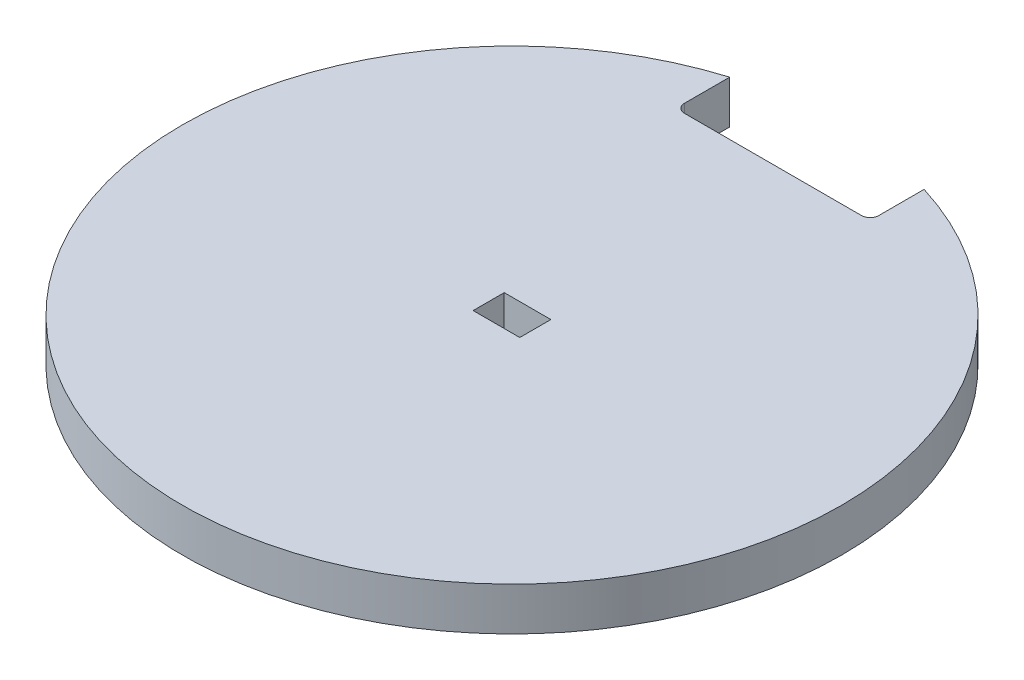
ISO-10303-21;
HEADER;
FILE_DESCRIPTION(('STEP AP214'),'2;1');
FILE_NAME('part.step','',(''),(''),'','','');
FILE_SCHEMA(('AUTOMOTIVE_DESIGN { 1 0 10303 214 1 1 1 1 }'));
ENDSEC;
DATA;
#1=APPLICATION_CONTEXT('core data for automotive mechanical design processes');
#2=APPLICATION_PROTOCOL_DEFINITION('international standard','automotive_design',2000,#1);
#3=PRODUCT_CONTEXT('',#1,'mechanical');
#4=PRODUCT('Part','Part','',(#3));
#5=PRODUCT_RELATED_PRODUCT_CATEGORY('part','',(#4));
#6=PRODUCT_DEFINITION_FORMATION('','',#4);
#7=PRODUCT_DEFINITION_CONTEXT('part definition',#1,'design');
#8=PRODUCT_DEFINITION('design','',#6,#7);
#9=PRODUCT_DEFINITION_SHAPE('','',#8);
#10=(LENGTH_UNIT() NAMED_UNIT(*) SI_UNIT(.MILLI.,.METRE.));
#11=(NAMED_UNIT(*) PLANE_ANGLE_UNIT() SI_UNIT($,.RADIAN.));
#12=(NAMED_UNIT(*) SI_UNIT($,.STERADIAN.) SOLID_ANGLE_UNIT());
#13=UNCERTAINTY_MEASURE_WITH_UNIT(LENGTH_MEASURE(1.E-05),#10,'distance_accuracy_value','');
#14=(GEOMETRIC_REPRESENTATION_CONTEXT(3) GLOBAL_UNCERTAINTY_ASSIGNED_CONTEXT((#13)) GLOBAL_UNIT_ASSIGNED_CONTEXT((#10,
#11,#12)) REPRESENTATION_CONTEXT('',''));
#15=CARTESIAN_POINT('',(0.,0.,0.));
#16=DIRECTION('',(0.,0.,1.));
#17=DIRECTION('',(1.,0.,0.));
#18=AXIS2_PLACEMENT_3D('',#15,#16,#17);
#19=CARTESIAN_POINT('',(-15.3543977496095,5.,0.));
#20=DIRECTION('',(1.,0.,0.));
#21=DIRECTION('',(0.,0.,-1.));
#22=AXIS2_PLACEMENT_3D('',#19,#20,#21);
#23=PLANE('',#22);
#24=DIRECTION('',(0.,0.,1.));
#25=VECTOR('',#24,1.);
#26=CARTESIAN_POINT('',(-15.3543977496095,0.,0.));
#27=LINE('',#26,#25);
#28=CARTESIAN_POINT('',(-15.3543977496095,0.,-36.4502996122106));
#29=VERTEX_POINT('',#28);
#30=CARTESIAN_POINT('',(-15.3543977496095,0.,-31.2026382228691));
#31=VERTEX_POINT('',#30);
#32=EDGE_CURVE('E179',#29,#31,#27,.T.);
#33=ORIENTED_EDGE('',*,*,#32,.F.);
#34=DIRECTION('',(0.,-1.,0.));
#35=VECTOR('',#34,1.);
#36=CARTESIAN_POINT('',(-15.3543977496095,5.,-36.4502996122106));
#37=LINE('',#36,#35);
#38=CARTESIAN_POINT('',(-15.3543977496095,5.,-36.4502996122106));
#39=VERTEX_POINT('',#38);
#40=EDGE_CURVE('E11',#39,#29,#37,.T.);
#41=ORIENTED_EDGE('',*,*,#40,.F.);
#42=DIRECTION('',(0.,0.,1.));
#43=VECTOR('',#42,1.);
#44=CARTESIAN_POINT('',(-15.3543977496095,5.,0.));
#45=LINE('',#44,#43);
#46=CARTESIAN_POINT('',(-15.3543977496095,5.,-31.2026382228691));
#47=VERTEX_POINT('',#46);
#48=EDGE_CURVE('E239',#39,#47,#45,.T.);
#49=ORIENTED_EDGE('',*,*,#48,.T.);
#50=DIRECTION('',(0.,-1.,0.));
#51=VECTOR('',#50,1.);
#52=CARTESIAN_POINT('',(-15.3543977496095,5.,-31.2026382228691));
#53=LINE('',#52,#51);
#54=EDGE_CURVE('E67',#47,#31,#53,.T.);
#55=ORIENTED_EDGE('',*,*,#54,.T.);
#56=EDGE_LOOP('',(#33,#41,#49,#55));
#57=FACE_BOUND('',#56,.T.);
#58=ADVANCED_FACE('F47',(#57),#23,.T.);
#59=CARTESIAN_POINT('',(-4.10439774960947,5.,0.));
#60=DIRECTION('',(0.,-1.,0.));
#61=DIRECTION('',(0.,0.,-1.));
#62=AXIS2_PLACEMENT_3D('',#59,#60,#61);
#63=CYLINDRICAL_SURFACE('',#62,38.1469113011777);
#64=CARTESIAN_POINT('',(-4.10439774960947,0.,0.));
#65=DIRECTION('',(0.,1.,0.));
#66=DIRECTION('',(0.,0.,1.));
#67=AXIS2_PLACEMENT_3D('',#64,#65,#66);
#68=CIRCLE('',#67,38.1469113011777);
#69=CARTESIAN_POINT('',(7.14560225039053,0.,-36.4502996122106));
#70=VERTEX_POINT('',#69);
#71=EDGE_CURVE('E182',#29,#70,#68,.T.);
#72=ORIENTED_EDGE('',*,*,#71,.T.);
#73=DIRECTION('',(0.,-1.,0.));
#74=VECTOR('',#73,1.);
#75=CARTESIAN_POINT('',(7.14560225039053,5.,-36.4502996122106));
#76=LINE('',#75,#74);
#77=CARTESIAN_POINT('',(7.14560225039053,5.,-36.4502996122106));
#78=VERTEX_POINT('',#77);
#79=EDGE_CURVE('E58',#78,#70,#76,.T.);
#80=ORIENTED_EDGE('',*,*,#79,.F.);
#81=CARTESIAN_POINT('',(-4.10439774960947,5.,0.));
#82=DIRECTION('',(0.,1.,0.));
#83=DIRECTION('',(0.,0.,1.));
#84=AXIS2_PLACEMENT_3D('',#81,#82,#83);
#85=CIRCLE('',#84,38.1469113011777);
#86=EDGE_CURVE('E244',#39,#78,#85,.T.);
#87=ORIENTED_EDGE('',*,*,#86,.F.);
#88=ORIENTED_EDGE('',*,*,#40,.T.);
#89=EDGE_LOOP('',(#72,#80,#87,#88));
#90=FACE_BOUND('',#89,.T.);
#91=ADVANCED_FACE('F254',(#90),#63,.T.);
#92=CARTESIAN_POINT('',(7.14560225039048,5.,0.));
#93=DIRECTION('',(1.,0.,0.));
#94=DIRECTION('',(0.,0.,-1.));
#95=AXIS2_PLACEMENT_3D('',#92,#93,#94);
#96=PLANE('',#95);
#97=DIRECTION('',(0.,0.,1.));
#98=VECTOR('',#97,1.);
#99=CARTESIAN_POINT('',(7.14560225039048,0.,0.));
#100=LINE('',#99,#98);
#101=CARTESIAN_POINT('',(7.14560225039052,0.,-31.2026382228691));
#102=VERTEX_POINT('',#101);
#103=EDGE_CURVE('E186',#70,#102,#100,.T.);
#104=ORIENTED_EDGE('',*,*,#103,.T.);
#105=DIRECTION('',(0.,-1.,0.));
#106=VECTOR('',#105,1.);
#107=CARTESIAN_POINT('',(7.14560225039052,5.,-31.2026382228691));
#108=LINE('',#107,#106);
#109=CARTESIAN_POINT('',(7.14560225039052,5.,-31.2026382228691));
#110=VERTEX_POINT('',#109);
#111=EDGE_CURVE('E142',#110,#102,#108,.T.);
#112=ORIENTED_EDGE('',*,*,#111,.F.);
#113=DIRECTION('',(0.,0.,1.));
#114=VECTOR('',#113,1.);
#115=CARTESIAN_POINT('',(7.14560225039048,5.,0.));
#116=LINE('',#115,#114);
#117=EDGE_CURVE('E151',#78,#110,#116,.T.);
#118=ORIENTED_EDGE('',*,*,#117,.F.);
#119=ORIENTED_EDGE('',*,*,#79,.T.);
#120=EDGE_LOOP('',(#104,#112,#118,#119));
#121=FACE_BOUND('',#120,.T.);
#122=ADVANCED_FACE('F257',(#121),#96,.F.);
#123=CARTESIAN_POINT('',(6.14560225039052,5.,-31.2026382228691));
#124=DIRECTION('',(0.,-1.,0.));
#125=DIRECTION('',(0.,0.,-1.));
#126=AXIS2_PLACEMENT_3D('',#123,#124,#125);
#127=CYLINDRICAL_SURFACE('',#126,1.);
#128=CARTESIAN_POINT('',(6.14560225039052,0.,-31.2026382228691));
#129=DIRECTION('',(0.,1.,0.));
#130=DIRECTION('',(0.,0.,1.));
#131=AXIS2_PLACEMENT_3D('',#128,#129,#130);
#132=CIRCLE('',#131,1.);
#133=CARTESIAN_POINT('',(6.14560225039052,0.,-30.2026382228691));
#134=VERTEX_POINT('',#133);
#135=EDGE_CURVE('E137',#134,#102,#132,.T.);
#136=ORIENTED_EDGE('',*,*,#135,.F.);
#137=DIRECTION('',(0.,-1.,0.));
#138=VECTOR('',#137,1.);
#139=CARTESIAN_POINT('',(6.14560225039052,5.,-30.2026382228691));
#140=LINE('',#139,#138);
#141=CARTESIAN_POINT('',(6.14560225039052,5.,-30.2026382228691));
#142=VERTEX_POINT('',#141);
#143=EDGE_CURVE('E132',#142,#134,#140,.T.);
#144=ORIENTED_EDGE('',*,*,#143,.F.);
#145=CARTESIAN_POINT('',(6.14560225039052,5.,-31.2026382228691));
#146=DIRECTION('',(0.,1.,0.));
#147=DIRECTION('',(0.,0.,1.));
#148=AXIS2_PLACEMENT_3D('',#145,#146,#147);
#149=CIRCLE('',#148,1.);
#150=EDGE_CURVE('E135',#142,#110,#149,.T.);
#151=ORIENTED_EDGE('',*,*,#150,.T.);
#152=ORIENTED_EDGE('',*,*,#111,.T.);
#153=EDGE_LOOP('',(#136,#144,#151,#152));
#154=FACE_BOUND('',#153,.T.);
#155=ADVANCED_FACE('F134',(#154),#127,.F.);
#156=CARTESIAN_POINT('',(0.,5.,-30.2026382228691));
#157=DIRECTION('',(0.,0.,-1.));
#158=DIRECTION('',(-1.,0.,0.));
#159=AXIS2_PLACEMENT_3D('',#156,#157,#158);
#160=PLANE('',#159);
#161=DIRECTION('',(1.,0.,0.));
#162=VECTOR('',#161,1.);
#163=CARTESIAN_POINT('',(0.,0.,-30.2026382228691));
#164=LINE('',#163,#162);
#165=CARTESIAN_POINT('',(-14.3543977496095,0.,-30.2026382228691));
#166=VERTEX_POINT('',#165);
#167=EDGE_CURVE('E192',#166,#134,#164,.T.);
#168=ORIENTED_EDGE('',*,*,#167,.F.);
#169=DIRECTION('',(0.,-1.,0.));
#170=VECTOR('',#169,1.);
#171=CARTESIAN_POINT('',(-14.3543977496095,5.,-30.2026382228691));
#172=LINE('',#171,#170);
#173=CARTESIAN_POINT('',(-14.3543977496095,5.,-30.2026382228691));
#174=VERTEX_POINT('',#173);
#175=EDGE_CURVE('E98',#174,#166,#172,.T.);
#176=ORIENTED_EDGE('',*,*,#175,.F.);
#177=DIRECTION('',(1.,0.,0.));
#178=VECTOR('',#177,1.);
#179=CARTESIAN_POINT('',(0.,5.,-30.2026382228691));
#180=LINE('',#179,#178);
#181=EDGE_CURVE('E149',#174,#142,#180,.T.);
#182=ORIENTED_EDGE('',*,*,#181,.T.);
#183=ORIENTED_EDGE('',*,*,#143,.T.);
#184=EDGE_LOOP('',(#168,#176,#182,#183));
#185=FACE_BOUND('',#184,.T.);
#186=ADVANCED_FACE('F155',(#185),#160,.T.);
#187=CARTESIAN_POINT('',(-1.40439774960945,5.,0.));
#188=DIRECTION('',(-1.,0.,0.));
#189=DIRECTION('',(0.,0.,1.));
#190=AXIS2_PLACEMENT_3D('',#187,#188,#189);
#191=PLANE('',#190);
#192=DIRECTION('',(0.,0.,-1.));
#193=VECTOR('',#192,1.);
#194=CARTESIAN_POINT('',(-1.40439774960945,0.,0.));
#195=LINE('',#194,#193);
#196=CARTESIAN_POINT('',(-1.40439774960945,0.,1.8));
#197=VERTEX_POINT('',#196);
#198=CARTESIAN_POINT('',(-1.40439774960945,0.,-1.8));
#199=VERTEX_POINT('',#198);
#200=EDGE_CURVE('E164',#197,#199,#195,.T.);
#201=ORIENTED_EDGE('',*,*,#200,.F.);
#202=DIRECTION('',(0.,-1.,0.));
#203=VECTOR('',#202,1.);
#204=CARTESIAN_POINT('',(-1.40439774960945,5.,1.8));
#205=LINE('',#204,#203);
#206=CARTESIAN_POINT('',(-1.40439774960945,5.,1.8));
#207=VERTEX_POINT('',#206);
#208=EDGE_CURVE('E51',#207,#197,#205,.T.);
#209=ORIENTED_EDGE('',*,*,#208,.F.);
#210=DIRECTION('',(0.,0.,-1.));
#211=VECTOR('',#210,1.);
#212=CARTESIAN_POINT('',(-1.40439774960945,5.,0.));
#213=LINE('',#212,#211);
#214=CARTESIAN_POINT('',(-1.40439774960945,5.,-1.8));
#215=VERTEX_POINT('',#214);
#216=EDGE_CURVE('E199',#207,#215,#213,.T.);
#217=ORIENTED_EDGE('',*,*,#216,.T.);
#218=DIRECTION('',(0.,-1.,0.));
#219=VECTOR('',#218,1.);
#220=CARTESIAN_POINT('',(-1.40439774960945,5.,-1.8));
#221=LINE('',#220,#219);
#222=EDGE_CURVE('E160',#215,#199,#221,.T.);
#223=ORIENTED_EDGE('',*,*,#222,.T.);
#224=EDGE_LOOP('',(#201,#209,#217,#223));
#225=FACE_BOUND('',#224,.T.);
#226=ADVANCED_FACE('F49',(#225),#191,.T.);
#227=CARTESIAN_POINT('',(0.,5.,1.8));
#228=DIRECTION('',(0.,0.,-1.));
#229=DIRECTION('',(-1.,0.,0.));
#230=AXIS2_PLACEMENT_3D('',#227,#228,#229);
#231=PLANE('',#230);
#232=DIRECTION('',(1.,0.,0.));
#233=VECTOR('',#232,1.);
#234=CARTESIAN_POINT('',(0.,0.,1.8));
#235=LINE('',#234,#233);
#236=CARTESIAN_POINT('',(-6.80439774960945,0.,1.8));
#237=VERTEX_POINT('',#236);
#238=EDGE_CURVE('E168',#237,#197,#235,.T.);
#239=ORIENTED_EDGE('',*,*,#238,.F.);
#240=DIRECTION('',(0.,-1.,0.));
#241=VECTOR('',#240,1.);
#242=CARTESIAN_POINT('',(-6.80439774960945,5.,1.8));
#243=LINE('',#242,#241);
#244=CARTESIAN_POINT('',(-6.80439774960945,5.,1.8));
#245=VERTEX_POINT('',#244);
#246=EDGE_CURVE('E214',#245,#237,#243,.T.);
#247=ORIENTED_EDGE('',*,*,#246,.F.);
#248=DIRECTION('',(1.,0.,0.));
#249=VECTOR('',#248,1.);
#250=CARTESIAN_POINT('',(0.,5.,1.8));
#251=LINE('',#250,#249);
#252=EDGE_CURVE('E225',#245,#207,#251,.T.);
#253=ORIENTED_EDGE('',*,*,#252,.T.);
#254=ORIENTED_EDGE('',*,*,#208,.T.);
#255=EDGE_LOOP('',(#239,#247,#253,#254));
#256=FACE_BOUND('',#255,.T.);
#257=ADVANCED_FACE('F223',(#256),#231,.T.);
#258=CARTESIAN_POINT('',(-6.80439774960945,5.,0.));
#259=DIRECTION('',(-1.,0.,0.));
#260=DIRECTION('',(0.,0.,1.));
#261=AXIS2_PLACEMENT_3D('',#258,#259,#260);
#262=PLANE('',#261);
#263=DIRECTION('',(0.,0.,-1.));
#264=VECTOR('',#263,1.);
#265=CARTESIAN_POINT('',(-6.80439774960945,0.,0.));
#266=LINE('',#265,#264);
#267=CARTESIAN_POINT('',(-6.80439774960945,0.,-1.8));
#268=VERTEX_POINT('',#267);
#269=EDGE_CURVE('E172',#237,#268,#266,.T.);
#270=ORIENTED_EDGE('',*,*,#269,.T.);
#271=DIRECTION('',(0.,-1.,0.));
#272=VECTOR('',#271,1.);
#273=CARTESIAN_POINT('',(-6.80439774960945,5.,-1.8));
#274=LINE('',#273,#272);
#275=CARTESIAN_POINT('',(-6.80439774960945,5.,-1.8));
#276=VERTEX_POINT('',#275);
#277=EDGE_CURVE('E211',#276,#268,#274,.T.);
#278=ORIENTED_EDGE('',*,*,#277,.F.);
#279=DIRECTION('',(0.,0.,-1.));
#280=VECTOR('',#279,1.);
#281=CARTESIAN_POINT('',(-6.80439774960945,5.,0.));
#282=LINE('',#281,#280);
#283=EDGE_CURVE('E240',#245,#276,#282,.T.);
#284=ORIENTED_EDGE('',*,*,#283,.F.);
#285=ORIENTED_EDGE('',*,*,#246,.T.);
#286=EDGE_LOOP('',(#270,#278,#284,#285));
#287=FACE_BOUND('',#286,.T.);
#288=ADVANCED_FACE('F232',(#287),#262,.F.);
#289=CARTESIAN_POINT('',(0.,5.,-1.8));
#290=DIRECTION('',(0.,0.,-1.));
#291=DIRECTION('',(-1.,0.,0.));
#292=AXIS2_PLACEMENT_3D('',#289,#290,#291);
#293=PLANE('',#292);
#294=DIRECTION('',(1.,0.,0.));
#295=VECTOR('',#294,1.);
#296=CARTESIAN_POINT('',(0.,0.,-1.8));
#297=LINE('',#296,#295);
#298=EDGE_CURVE('E175',#268,#199,#297,.T.);
#299=ORIENTED_EDGE('',*,*,#298,.T.);
#300=ORIENTED_EDGE('',*,*,#222,.F.);
#301=DIRECTION('',(1.,0.,0.));
#302=VECTOR('',#301,1.);
#303=CARTESIAN_POINT('',(0.,5.,-1.8));
#304=LINE('',#303,#302);
#305=EDGE_CURVE('E236',#276,#215,#304,.T.);
#306=ORIENTED_EDGE('',*,*,#305,.F.);
#307=ORIENTED_EDGE('',*,*,#277,.T.);
#308=EDGE_LOOP('',(#299,#300,#306,#307));
#309=FACE_BOUND('',#308,.T.);
#310=ADVANCED_FACE('F235',(#309),#293,.F.);
#311=CARTESIAN_POINT('',(-14.3543977496095,5.,-31.2026382228691));
#312=DIRECTION('',(0.,-1.,0.));
#313=DIRECTION('',(0.,0.,-1.));
#314=AXIS2_PLACEMENT_3D('',#311,#312,#313);
#315=CYLINDRICAL_SURFACE('',#314,1.);
#316=CARTESIAN_POINT('',(-14.3543977496095,0.,-31.2026382228691));
#317=DIRECTION('',(0.,1.,0.));
#318=DIRECTION('',(0.,0.,1.));
#319=AXIS2_PLACEMENT_3D('',#316,#317,#318);
#320=CIRCLE('',#319,1.);
#321=EDGE_CURVE('E195',#31,#166,#320,.T.);
#322=ORIENTED_EDGE('',*,*,#321,.F.);
#323=ORIENTED_EDGE('',*,*,#54,.F.);
#324=CARTESIAN_POINT('',(-14.3543977496095,5.,-31.2026382228691));
#325=DIRECTION('',(0.,1.,0.));
#326=DIRECTION('',(0.,0.,1.));
#327=AXIS2_PLACEMENT_3D('',#324,#325,#326);
#328=CIRCLE('',#327,1.);
#329=EDGE_CURVE('E157',#47,#174,#328,.T.);
#330=ORIENTED_EDGE('',*,*,#329,.T.);
#331=ORIENTED_EDGE('',*,*,#175,.T.);
#332=EDGE_LOOP('',(#322,#323,#330,#331));
#333=FACE_BOUND('',#332,.T.);
#334=ADVANCED_FACE('F258',(#333),#315,.F.);
#335=CARTESIAN_POINT('',(0.,5.,0.));
#336=DIRECTION('',(0.,1.,0.));
#337=DIRECTION('',(0.,0.,1.));
#338=AXIS2_PLACEMENT_3D('',#335,#336,#337);
#339=PLANE('',#338);
#340=ORIENTED_EDGE('',*,*,#216,.F.);
#341=ORIENTED_EDGE('',*,*,#252,.F.);
#342=ORIENTED_EDGE('',*,*,#283,.T.);
#343=ORIENTED_EDGE('',*,*,#305,.T.);
#344=EDGE_LOOP('',(#340,#341,#342,#343));
#345=FACE_BOUND('',#344,.T.);
#346=ORIENTED_EDGE('',*,*,#48,.F.);
#347=ORIENTED_EDGE('',*,*,#86,.T.);
#348=ORIENTED_EDGE('',*,*,#117,.T.);
#349=ORIENTED_EDGE('',*,*,#150,.F.);
#350=ORIENTED_EDGE('',*,*,#181,.F.);
#351=ORIENTED_EDGE('',*,*,#329,.F.);
#352=EDGE_LOOP('',(#346,#347,#348,#349,#350,#351));
#353=FACE_BOUND('',#352,.T.);
#354=ADVANCED_FACE('F147',(#345,#353),#339,.T.);
#355=CARTESIAN_POINT('',(0.,0.,0.));
#356=DIRECTION('',(0.,1.,0.));
#357=DIRECTION('',(0.,0.,1.));
#358=AXIS2_PLACEMENT_3D('',#355,#356,#357);
#359=PLANE('',#358);
#360=ORIENTED_EDGE('',*,*,#200,.T.);
#361=ORIENTED_EDGE('',*,*,#298,.F.);
#362=ORIENTED_EDGE('',*,*,#269,.F.);
#363=ORIENTED_EDGE('',*,*,#238,.T.);
#364=EDGE_LOOP('',(#360,#361,#362,#363));
#365=FACE_BOUND('',#364,.T.);
#366=ORIENTED_EDGE('',*,*,#32,.T.);
#367=ORIENTED_EDGE('',*,*,#321,.T.);
#368=ORIENTED_EDGE('',*,*,#167,.T.);
#369=ORIENTED_EDGE('',*,*,#135,.T.);
#370=ORIENTED_EDGE('',*,*,#103,.F.);
#371=ORIENTED_EDGE('',*,*,#71,.F.);
#372=EDGE_LOOP('',(#366,#367,#368,#369,#370,#371));
#373=FACE_BOUND('',#372,.T.);
#374=ADVANCED_FACE('F229',(#365,#373),#359,.F.);
#375=CLOSED_SHELL('',(#58,#91,#122,#155,#186,#226,#257,#288,#310,#334,#354,#374));
#376=MANIFOLD_SOLID_BREP('B2',#375);
#377=ADVANCED_BREP_SHAPE_REPRESENTATION('',(#18,#376),#14);
#378=SHAPE_DEFINITION_REPRESENTATION(#9,#377);
ENDSEC;
END-ISO-10303-21;
